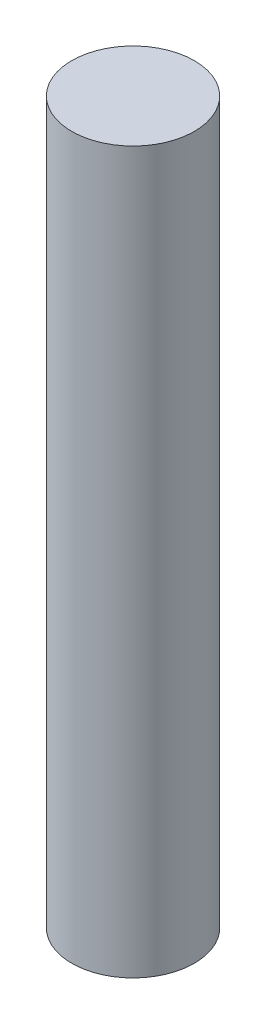
ISO-10303-21;
HEADER;
FILE_DESCRIPTION(('STEP AP214'),'2;1');
FILE_NAME('part.step','',(''),(''),'','','');
FILE_SCHEMA(('AUTOMOTIVE_DESIGN { 1 0 10303 214 1 1 1 1 }'));
ENDSEC;
DATA;
#1=APPLICATION_CONTEXT('core data for automotive mechanical design processes');
#2=APPLICATION_PROTOCOL_DEFINITION('international standard','automotive_design',2000,#1);
#3=PRODUCT_CONTEXT('',#1,'mechanical');
#4=PRODUCT('Part','Part','',(#3));
#5=PRODUCT_RELATED_PRODUCT_CATEGORY('part','',(#4));
#6=PRODUCT_DEFINITION_FORMATION('','',#4);
#7=PRODUCT_DEFINITION_CONTEXT('part definition',#1,'design');
#8=PRODUCT_DEFINITION('design','',#6,#7);
#9=PRODUCT_DEFINITION_SHAPE('','',#8);
#10=(LENGTH_UNIT() NAMED_UNIT(*) SI_UNIT(.MILLI.,.METRE.));
#11=(NAMED_UNIT(*) PLANE_ANGLE_UNIT() SI_UNIT($,.RADIAN.));
#12=(NAMED_UNIT(*) SI_UNIT($,.STERADIAN.) SOLID_ANGLE_UNIT());
#13=UNCERTAINTY_MEASURE_WITH_UNIT(LENGTH_MEASURE(1.E-05),#10,'distance_accuracy_value','');
#14=(GEOMETRIC_REPRESENTATION_CONTEXT(3) GLOBAL_UNCERTAINTY_ASSIGNED_CONTEXT((#13)) GLOBAL_UNIT_ASSIGNED_CONTEXT((#10,
#11,#12)) REPRESENTATION_CONTEXT('',''));
#15=CARTESIAN_POINT('',(0.,0.,0.));
#16=DIRECTION('',(0.,0.,1.));
#17=DIRECTION('',(1.,0.,0.));
#18=AXIS2_PLACEMENT_3D('',#15,#16,#17);
#19=CARTESIAN_POINT('',(0.,470.,0.));
#20=DIRECTION('',(0.,-1.,0.));
#21=DIRECTION('',(0.,0.,-1.));
#22=AXIS2_PLACEMENT_3D('',#19,#20,#21);
#23=CYLINDRICAL_SURFACE('',#22,40.);
#24=CARTESIAN_POINT('',(0.,470.,0.));
#25=DIRECTION('',(0.,1.,0.));
#26=DIRECTION('',(0.,0.,1.));
#27=AXIS2_PLACEMENT_3D('',#24,#25,#26);
#28=CIRCLE('',#27,40.);
#29=CARTESIAN_POINT('',(0.,470.,-40.));
#30=VERTEX_POINT('',#29);
#31=EDGE_CURVE('E10',#30,#30,#28,.T.);
#32=CARTESIAN_POINT('',(0.,0.,0.));
#33=DIRECTION('',(0.,1.,0.));
#34=DIRECTION('',(0.,0.,1.));
#35=AXIS2_PLACEMENT_3D('',#32,#33,#34);
#36=CIRCLE('',#35,40.);
#37=CARTESIAN_POINT('',(0.,0.,-40.));
#38=VERTEX_POINT('',#37);
#39=EDGE_CURVE('E34',#38,#38,#36,.T.);
#40=CARTESIAN_POINT('',(0.,470.,-40.));
#41=CARTESIAN_POINT('',(0.,465.104166666667,-40.));
#42=CARTESIAN_POINT('',(0.,460.208333333333,-40.));
#43=CARTESIAN_POINT('',(0.,450.416666666667,-40.));
#44=CARTESIAN_POINT('',(0.,445.520833333333,-40.));
#45=CARTESIAN_POINT('',(0.,435.729166666667,-40.));
#46=CARTESIAN_POINT('',(0.,430.833333333333,-40.));
#47=CARTESIAN_POINT('',(0.,421.041666666667,-40.));
#48=CARTESIAN_POINT('',(0.,416.145833333333,-40.));
#49=CARTESIAN_POINT('',(0.,406.354166666667,-40.));
#50=CARTESIAN_POINT('',(0.,401.458333333333,-40.));
#51=CARTESIAN_POINT('',(0.,391.666666666667,-40.));
#52=CARTESIAN_POINT('',(0.,386.770833333333,-40.));
#53=CARTESIAN_POINT('',(0.,376.979166666667,-40.));
#54=CARTESIAN_POINT('',(0.,372.083333333333,-40.));
#55=CARTESIAN_POINT('',(0.,362.291666666667,-40.));
#56=CARTESIAN_POINT('',(0.,357.395833333333,-40.));
#57=CARTESIAN_POINT('',(0.,347.604166666667,-40.));
#58=CARTESIAN_POINT('',(0.,342.708333333333,-40.));
#59=CARTESIAN_POINT('',(0.,332.916666666667,-40.));
#60=CARTESIAN_POINT('',(0.,328.020833333333,-40.));
#61=CARTESIAN_POINT('',(0.,318.229166666667,-40.));
#62=CARTESIAN_POINT('',(0.,313.333333333333,-40.));
#63=CARTESIAN_POINT('',(0.,303.541666666667,-40.));
#64=CARTESIAN_POINT('',(0.,298.645833333333,-40.));
#65=CARTESIAN_POINT('',(0.,288.854166666667,-40.));
#66=CARTESIAN_POINT('',(0.,283.958333333333,-40.));
#67=CARTESIAN_POINT('',(0.,274.166666666667,-40.));
#68=CARTESIAN_POINT('',(0.,269.270833333333,-40.));
#69=CARTESIAN_POINT('',(0.,259.479166666667,-40.));
#70=CARTESIAN_POINT('',(0.,254.583333333333,-40.));
#71=CARTESIAN_POINT('',(0.,244.791666666667,-40.));
#72=CARTESIAN_POINT('',(0.,239.895833333333,-40.));
#73=CARTESIAN_POINT('',(0.,230.104166666667,-40.));
#74=CARTESIAN_POINT('',(0.,225.208333333333,-40.));
#75=CARTESIAN_POINT('',(0.,215.416666666667,-40.));
#76=CARTESIAN_POINT('',(0.,210.520833333333,-40.));
#77=CARTESIAN_POINT('',(0.,200.729166666667,-40.));
#78=CARTESIAN_POINT('',(0.,195.833333333333,-40.));
#79=CARTESIAN_POINT('',(0.,186.041666666667,-40.));
#80=CARTESIAN_POINT('',(0.,181.145833333333,-40.));
#81=CARTESIAN_POINT('',(0.,171.354166666667,-40.));
#82=CARTESIAN_POINT('',(0.,166.458333333333,-40.));
#83=CARTESIAN_POINT('',(0.,156.666666666667,-40.));
#84=CARTESIAN_POINT('',(0.,151.770833333333,-40.));
#85=CARTESIAN_POINT('',(0.,141.979166666667,-40.));
#86=CARTESIAN_POINT('',(0.,137.083333333333,-40.));
#87=CARTESIAN_POINT('',(0.,127.291666666667,-40.));
#88=CARTESIAN_POINT('',(0.,122.395833333333,-40.));
#89=CARTESIAN_POINT('',(0.,112.604166666667,-40.));
#90=CARTESIAN_POINT('',(0.,107.708333333333,-40.));
#91=CARTESIAN_POINT('',(0.,97.9166666666666,-40.));
#92=CARTESIAN_POINT('',(0.,93.0208333333333,-40.));
#93=CARTESIAN_POINT('',(0.,83.2291666666666,-40.));
#94=CARTESIAN_POINT('',(0.,78.3333333333333,-40.));
#95=CARTESIAN_POINT('',(0.,68.5416666666666,-40.));
#96=CARTESIAN_POINT('',(0.,63.6458333333333,-40.));
#97=CARTESIAN_POINT('',(0.,53.8541666666666,-40.));
#98=CARTESIAN_POINT('',(0.,48.9583333333333,-40.));
#99=CARTESIAN_POINT('',(0.,39.1666666666666,-40.));
#100=CARTESIAN_POINT('',(0.,34.2708333333333,-40.));
#101=CARTESIAN_POINT('',(0.,24.4791666666666,-40.));
#102=CARTESIAN_POINT('',(0.,19.5833333333333,-40.));
#103=CARTESIAN_POINT('',(0.,9.79166666666662,-40.));
#104=CARTESIAN_POINT('',(0.,4.89583333333328,-40.));
#105=CARTESIAN_POINT('',(0.,0.,-40.));
#106=B_SPLINE_CURVE_WITH_KNOTS('',3,(#40,#41,#42,#43,#44,#45,#46,#47,#48,#49,#50,#51,#52,#53,
#54,#55,#56,#57,#58,#59,#60,#61,#62,#63,#64,#65,#66,#67,#68,#69,#70,#71,#72,#73,#74,#75,#76,#77,
#78,#79,#80,#81,#82,#83,#84,#85,#86,#87,#88,#89,#90,#91,#92,#93,#94,#95,#96,#97,#98,#99,#100,
#101,#102,#103,#104,#105),.UNSPECIFIED.,.F.,.F.,(4,2,2,2,2,2,2,2,2,2,2,2,2,2,2,2,2,2,2,2,2,2,2,
2,2,2,2,2,2,2,2,2,4),(0.,14.6875,29.375,44.0625,58.75,73.4375,88.125,102.8125,117.5,132.1875,
146.875,161.5625,176.25,190.9375,205.625,220.3125,235.,249.6875,264.375,279.0625,293.75,
308.4375,323.125,337.8125,352.5,367.1875,381.875,396.5625,411.25,425.9375,440.625,455.3125,
470.),.UNSPECIFIED.);
#107=EDGE_CURVE('BSEAM31',#30,#38,#106,.T.);
#108=ORIENTED_EDGE('',*,*,#31,.F.);
#109=ORIENTED_EDGE('',*,*,#39,.T.);
#110=ORIENTED_EDGE('',*,*,#107,.T.);
#111=ORIENTED_EDGE('',*,*,#107,.F.);
#112=EDGE_LOOP('',(#108,#110,#109,#111));
#113=FACE_BOUND('',#112,.T.);
#114=ADVANCED_FACE('F31',(#113),#23,.T.);
#115=CARTESIAN_POINT('',(0.,470.,0.));
#116=DIRECTION('',(0.,1.,0.));
#117=DIRECTION('',(0.,0.,1.));
#118=AXIS2_PLACEMENT_3D('',#115,#116,#117);
#119=PLANE('',#118);
#120=ORIENTED_EDGE('',*,*,#31,.T.);
#121=EDGE_LOOP('',(#120));
#122=FACE_BOUND('',#121,.T.);
#123=ADVANCED_FACE('F46',(#122),#119,.T.);
#124=CARTESIAN_POINT('',(0.,0.,0.));
#125=DIRECTION('',(0.,1.,0.));
#126=DIRECTION('',(0.,0.,1.));
#127=AXIS2_PLACEMENT_3D('',#124,#125,#126);
#128=PLANE('',#127);
#129=ORIENTED_EDGE('',*,*,#39,.F.);
#130=EDGE_LOOP('',(#129));
#131=FACE_BOUND('',#130,.T.);
#132=ADVANCED_FACE('F44',(#131),#128,.F.);
#133=CLOSED_SHELL('',(#114,#123,#132));
#134=MANIFOLD_SOLID_BREP('B2',#133);
#135=ADVANCED_BREP_SHAPE_REPRESENTATION('',(#18,#134),#14);
#136=SHAPE_DEFINITION_REPRESENTATION(#9,#135);
ENDSEC;
END-ISO-10303-21;
